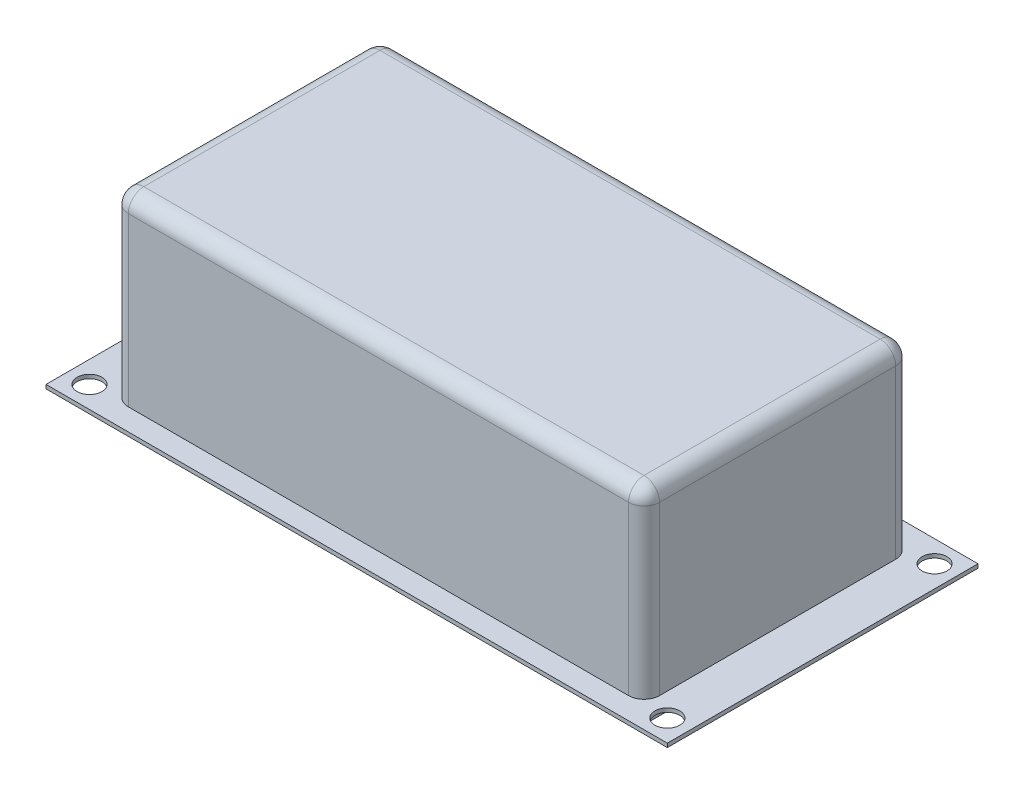
ISO-10303-21;
HEADER;
FILE_DESCRIPTION(('STEP AP214'),'2;1');
FILE_NAME('part.step','',(''),(''),'','','');
FILE_SCHEMA(('AUTOMOTIVE_DESIGN { 1 0 10303 214 1 1 1 1 }'));
ENDSEC;
DATA;
#1=APPLICATION_CONTEXT('core data for automotive mechanical design processes');
#2=APPLICATION_PROTOCOL_DEFINITION('international standard','automotive_design',2000,#1);
#3=PRODUCT_CONTEXT('',#1,'mechanical');
#4=PRODUCT('Part','Part','',(#3));
#5=PRODUCT_RELATED_PRODUCT_CATEGORY('part','',(#4));
#6=PRODUCT_DEFINITION_FORMATION('','',#4);
#7=PRODUCT_DEFINITION_CONTEXT('part definition',#1,'design');
#8=PRODUCT_DEFINITION('design','',#6,#7);
#9=PRODUCT_DEFINITION_SHAPE('','',#8);
#10=(LENGTH_UNIT() NAMED_UNIT(*) SI_UNIT(.MILLI.,.METRE.));
#11=(NAMED_UNIT(*) PLANE_ANGLE_UNIT() SI_UNIT($,.RADIAN.));
#12=(NAMED_UNIT(*) SI_UNIT($,.STERADIAN.) SOLID_ANGLE_UNIT());
#13=UNCERTAINTY_MEASURE_WITH_UNIT(LENGTH_MEASURE(1.E-05),#10,'distance_accuracy_value','');
#14=(GEOMETRIC_REPRESENTATION_CONTEXT(3) GLOBAL_UNCERTAINTY_ASSIGNED_CONTEXT((#13)) GLOBAL_UNIT_ASSIGNED_CONTEXT((#10,
#11,#12)) REPRESENTATION_CONTEXT('',''));
#15=CARTESIAN_POINT('',(0.,0.,0.));
#16=DIRECTION('',(0.,0.,1.));
#17=DIRECTION('',(1.,0.,0.));
#18=AXIS2_PLACEMENT_3D('',#15,#16,#17);
#19=CARTESIAN_POINT('',(0.,0.3175,0.));
#20=DIRECTION('',(0.,1.,0.));
#21=DIRECTION('',(0.,0.,1.));
#22=AXIS2_PLACEMENT_3D('',#19,#20,#21);
#23=PLANE('',#22);
#24=CARTESIAN_POINT('',(47.244,0.3175,21.844));
#25=DIRECTION('',(0.,-1.,0.));
#26=DIRECTION('',(0.,0.,1.));
#27=AXIS2_PLACEMENT_3D('',#24,#25,#26);
#28=CIRCLE('',#27,2.032);
#29=CARTESIAN_POINT('',(47.244,0.3175,23.876));
#30=VERTEX_POINT('',#29);
#31=EDGE_CURVE('E191',#30,#30,#28,.T.);
#32=ORIENTED_EDGE('',*,*,#31,.T.);
#33=EDGE_LOOP('',(#32));
#34=FACE_BOUND('',#33,.T.);
#35=CARTESIAN_POINT('',(47.244,0.3175,-21.844));
#36=DIRECTION('',(0.,1.,0.));
#37=DIRECTION('',(0.,0.,-1.));
#38=AXIS2_PLACEMENT_3D('',#35,#36,#37);
#39=CIRCLE('',#38,2.032);
#40=CARTESIAN_POINT('',(47.244,0.3175,-23.876));
#41=VERTEX_POINT('',#40);
#42=EDGE_CURVE('E199',#41,#41,#39,.T.);
#43=ORIENTED_EDGE('',*,*,#42,.F.);
#44=EDGE_LOOP('',(#43));
#45=FACE_BOUND('',#44,.T.);
#46=CARTESIAN_POINT('',(-47.244,0.3175,-21.844));
#47=DIRECTION('',(0.,-1.,0.));
#48=DIRECTION('',(0.,0.,-1.));
#49=AXIS2_PLACEMENT_3D('',#46,#47,#48);
#50=CIRCLE('',#49,2.032);
#51=CARTESIAN_POINT('',(-47.244,0.3175,-23.876));
#52=VERTEX_POINT('',#51);
#53=EDGE_CURVE('E205',#52,#52,#50,.T.);
#54=ORIENTED_EDGE('',*,*,#53,.T.);
#55=EDGE_LOOP('',(#54));
#56=FACE_BOUND('',#55,.T.);
#57=CARTESIAN_POINT('',(-47.244,0.3175,21.844));
#58=DIRECTION('',(0.,1.,0.));
#59=DIRECTION('',(0.,0.,1.));
#60=AXIS2_PLACEMENT_3D('',#57,#58,#59);
#61=CIRCLE('',#60,2.032);
#62=CARTESIAN_POINT('',(-47.244,0.3175,23.876));
#63=VERTEX_POINT('',#62);
#64=EDGE_CURVE('E211',#63,#63,#61,.T.);
#65=ORIENTED_EDGE('',*,*,#64,.F.);
#66=EDGE_LOOP('',(#65));
#67=FACE_BOUND('',#66,.T.);
#68=DIRECTION('',(0.,0.,-1.));
#69=VECTOR('',#68,1.);
#70=CARTESIAN_POINT('',(50.8,0.3175,-25.4));
#71=LINE('',#70,#69);
#72=CARTESIAN_POINT('',(50.8,0.3175,25.4));
#73=VERTEX_POINT('',#72);
#74=CARTESIAN_POINT('',(50.8,0.3175,-25.4));
#75=VERTEX_POINT('',#74);
#76=EDGE_CURVE('E220',#73,#75,#71,.T.);
#77=ORIENTED_EDGE('',*,*,#76,.T.);
#78=DIRECTION('',(-1.,0.,0.));
#79=VECTOR('',#78,1.);
#80=CARTESIAN_POINT('',(-50.8,0.3175,-25.4));
#81=LINE('',#80,#79);
#82=CARTESIAN_POINT('',(-50.8,0.3175,-25.4));
#83=VERTEX_POINT('',#82);
#84=EDGE_CURVE('E223',#75,#83,#81,.T.);
#85=ORIENTED_EDGE('',*,*,#84,.T.);
#86=DIRECTION('',(0.,0.,1.));
#87=VECTOR('',#86,1.);
#88=CARTESIAN_POINT('',(-50.8,0.3175,-25.4));
#89=LINE('',#88,#87);
#90=CARTESIAN_POINT('',(-50.8,0.3175,25.4));
#91=VERTEX_POINT('',#90);
#92=EDGE_CURVE('E226',#83,#91,#89,.T.);
#93=ORIENTED_EDGE('',*,*,#92,.T.);
#94=DIRECTION('',(1.,0.,0.));
#95=VECTOR('',#94,1.);
#96=CARTESIAN_POINT('',(-50.8,0.3175,25.4));
#97=LINE('',#96,#95);
#98=EDGE_CURVE('E228',#91,#73,#97,.T.);
#99=ORIENTED_EDGE('',*,*,#98,.T.);
#100=EDGE_LOOP('',(#77,#85,#93,#99));
#101=FACE_BOUND('',#100,.T.);
#102=DIRECTION('',(0.,0.,-1.));
#103=VECTOR('',#102,1.);
#104=CARTESIAN_POINT('',(-43.434,0.3175,0.));
#105=LINE('',#104,#103);
#106=CARTESIAN_POINT('',(-43.434,0.3175,19.304));
#107=VERTEX_POINT('',#106);
#108=CARTESIAN_POINT('',(-43.434,0.3175,-19.304));
#109=VERTEX_POINT('',#108);
#110=EDGE_CURVE('E261',#107,#109,#105,.T.);
#111=ORIENTED_EDGE('',*,*,#110,.T.);
#112=CARTESIAN_POINT('',(-40.894,0.317499999999998,-19.304));
#113=DIRECTION('',(0.,1.,0.));
#114=DIRECTION('',(0.,0.,1.));
#115=AXIS2_PLACEMENT_3D('',#112,#113,#114);
#116=CIRCLE('',#115,2.54);
#117=CARTESIAN_POINT('',(-40.894,0.3175,-21.844));
#118=VERTEX_POINT('',#117);
#119=EDGE_CURVE('E302',#109,#118,#116,.F.);
#120=ORIENTED_EDGE('',*,*,#119,.T.);
#121=DIRECTION('',(1.,0.,0.));
#122=VECTOR('',#121,1.);
#123=CARTESIAN_POINT('',(0.,0.3175,-21.844));
#124=LINE('',#123,#122);
#125=CARTESIAN_POINT('',(40.894,0.3175,-21.844));
#126=VERTEX_POINT('',#125);
#127=EDGE_CURVE('E264',#118,#126,#124,.T.);
#128=ORIENTED_EDGE('',*,*,#127,.T.);
#129=CARTESIAN_POINT('',(40.894,0.317499999999998,-19.304));
#130=DIRECTION('',(0.,1.,0.));
#131=DIRECTION('',(0.,0.,1.));
#132=AXIS2_PLACEMENT_3D('',#129,#130,#131);
#133=CIRCLE('',#132,2.54);
#134=CARTESIAN_POINT('',(43.434,0.3175,-19.304));
#135=VERTEX_POINT('',#134);
#136=EDGE_CURVE('E304',#126,#135,#133,.F.);
#137=ORIENTED_EDGE('',*,*,#136,.T.);
#138=DIRECTION('',(0.,0.,1.));
#139=VECTOR('',#138,1.);
#140=CARTESIAN_POINT('',(43.434,0.3175,0.));
#141=LINE('',#140,#139);
#142=CARTESIAN_POINT('',(43.434,0.3175,19.304));
#143=VERTEX_POINT('',#142);
#144=EDGE_CURVE('E267',#135,#143,#141,.T.);
#145=ORIENTED_EDGE('',*,*,#144,.T.);
#146=CARTESIAN_POINT('',(40.894,0.317499999999998,19.304));
#147=DIRECTION('',(0.,1.,0.));
#148=DIRECTION('',(0.,0.,1.));
#149=AXIS2_PLACEMENT_3D('',#146,#147,#148);
#150=CIRCLE('',#149,2.54);
#151=CARTESIAN_POINT('',(40.894,0.3175,21.844));
#152=VERTEX_POINT('',#151);
#153=EDGE_CURVE('E42',#143,#152,#150,.F.);
#154=ORIENTED_EDGE('',*,*,#153,.T.);
#155=DIRECTION('',(-1.,0.,0.));
#156=VECTOR('',#155,1.);
#157=CARTESIAN_POINT('',(0.,0.3175,21.844));
#158=LINE('',#157,#156);
#159=CARTESIAN_POINT('',(-40.894,0.3175,21.844));
#160=VERTEX_POINT('',#159);
#161=EDGE_CURVE('E258',#152,#160,#158,.T.);
#162=ORIENTED_EDGE('',*,*,#161,.T.);
#163=CARTESIAN_POINT('',(-40.894,0.317499999999998,19.304));
#164=DIRECTION('',(0.,1.,0.));
#165=DIRECTION('',(0.,0.,1.));
#166=AXIS2_PLACEMENT_3D('',#163,#164,#165);
#167=CIRCLE('',#166,2.54);
#168=EDGE_CURVE('E11',#160,#107,#167,.F.);
#169=ORIENTED_EDGE('',*,*,#168,.T.);
#170=EDGE_LOOP('',(#111,#120,#128,#137,#145,#154,#162,#169));
#171=FACE_BOUND('',#170,.T.);
#172=ADVANCED_FACE('F33',(#34,#45,#56,#67,#101,#171),#23,.T.);
#173=CARTESIAN_POINT('',(50.8,0.3175,-25.4));
#174=DIRECTION('',(-1.,0.,0.));
#175=DIRECTION('',(0.,0.,1.));
#176=AXIS2_PLACEMENT_3D('',#173,#174,#175);
#177=PLANE('',#176);
#178=DIRECTION('',(0.,0.,-1.));
#179=VECTOR('',#178,1.);
#180=CARTESIAN_POINT('',(50.8,-0.3175,-25.4));
#181=LINE('',#180,#179);
#182=CARTESIAN_POINT('',(50.8,-0.3175,25.4));
#183=VERTEX_POINT('',#182);
#184=CARTESIAN_POINT('',(50.8,-0.3175,-25.4));
#185=VERTEX_POINT('',#184);
#186=EDGE_CURVE('E217',#183,#185,#181,.T.);
#187=ORIENTED_EDGE('',*,*,#186,.T.);
#188=DIRECTION('',(0.,-1.,0.));
#189=VECTOR('',#188,1.);
#190=CARTESIAN_POINT('',(50.8,0.3175,-25.4));
#191=LINE('',#190,#189);
#192=EDGE_CURVE('E246',#75,#185,#191,.T.);
#193=ORIENTED_EDGE('',*,*,#192,.F.);
#194=ORIENTED_EDGE('',*,*,#76,.F.);
#195=DIRECTION('',(0.,-1.,0.));
#196=VECTOR('',#195,1.);
#197=CARTESIAN_POINT('',(50.8,0.3175,25.4));
#198=LINE('',#197,#196);
#199=EDGE_CURVE('E230',#73,#183,#198,.T.);
#200=ORIENTED_EDGE('',*,*,#199,.T.);
#201=EDGE_LOOP('',(#187,#193,#194,#200));
#202=FACE_BOUND('',#201,.T.);
#203=ADVANCED_FACE('F408',(#202),#177,.F.);
#204=CARTESIAN_POINT('',(-50.8,0.3175,-25.4));
#205=DIRECTION('',(0.,0.,1.));
#206=DIRECTION('',(1.,0.,0.));
#207=AXIS2_PLACEMENT_3D('',#204,#205,#206);
#208=PLANE('',#207);
#209=DIRECTION('',(-1.,0.,0.));
#210=VECTOR('',#209,1.);
#211=CARTESIAN_POINT('',(-50.8,-0.3175,-25.4));
#212=LINE('',#211,#210);
#213=CARTESIAN_POINT('',(-50.8,-0.3175,-25.4));
#214=VERTEX_POINT('',#213);
#215=EDGE_CURVE('E233',#185,#214,#212,.T.);
#216=ORIENTED_EDGE('',*,*,#215,.T.);
#217=DIRECTION('',(0.,-1.,0.));
#218=VECTOR('',#217,1.);
#219=CARTESIAN_POINT('',(-50.8,0.3175,-25.4));
#220=LINE('',#219,#218);
#221=EDGE_CURVE('E243',#83,#214,#220,.T.);
#222=ORIENTED_EDGE('',*,*,#221,.F.);
#223=ORIENTED_EDGE('',*,*,#84,.F.);
#224=ORIENTED_EDGE('',*,*,#192,.T.);
#225=EDGE_LOOP('',(#216,#222,#223,#224));
#226=FACE_BOUND('',#225,.T.);
#227=ADVANCED_FACE('F414',(#226),#208,.F.);
#228=CARTESIAN_POINT('',(-50.8,0.3175,-25.4));
#229=DIRECTION('',(1.,0.,0.));
#230=DIRECTION('',(0.,0.,-1.));
#231=AXIS2_PLACEMENT_3D('',#228,#229,#230);
#232=PLANE('',#231);
#233=DIRECTION('',(0.,0.,1.));
#234=VECTOR('',#233,1.);
#235=CARTESIAN_POINT('',(-50.8,-0.3175,-25.4));
#236=LINE('',#235,#234);
#237=CARTESIAN_POINT('',(-50.8,-0.3175,25.4));
#238=VERTEX_POINT('',#237);
#239=EDGE_CURVE('E235',#214,#238,#236,.T.);
#240=ORIENTED_EDGE('',*,*,#239,.T.);
#241=DIRECTION('',(0.,-1.,0.));
#242=VECTOR('',#241,1.);
#243=CARTESIAN_POINT('',(-50.8,0.3175,25.4));
#244=LINE('',#243,#242);
#245=EDGE_CURVE('E240',#91,#238,#244,.T.);
#246=ORIENTED_EDGE('',*,*,#245,.F.);
#247=ORIENTED_EDGE('',*,*,#92,.F.);
#248=ORIENTED_EDGE('',*,*,#221,.T.);
#249=EDGE_LOOP('',(#240,#246,#247,#248));
#250=FACE_BOUND('',#249,.T.);
#251=ADVANCED_FACE('F429',(#250),#232,.F.);
#252=CARTESIAN_POINT('',(-50.8,0.3175,25.4));
#253=DIRECTION('',(0.,0.,-1.));
#254=DIRECTION('',(-1.,0.,0.));
#255=AXIS2_PLACEMENT_3D('',#252,#253,#254);
#256=PLANE('',#255);
#257=DIRECTION('',(1.,0.,0.));
#258=VECTOR('',#257,1.);
#259=CARTESIAN_POINT('',(-50.8,-0.3175,25.4));
#260=LINE('',#259,#258);
#261=EDGE_CURVE('E224',#238,#183,#260,.T.);
#262=ORIENTED_EDGE('',*,*,#261,.T.);
#263=ORIENTED_EDGE('',*,*,#199,.F.);
#264=ORIENTED_EDGE('',*,*,#98,.F.);
#265=ORIENTED_EDGE('',*,*,#245,.T.);
#266=EDGE_LOOP('',(#262,#263,#264,#265));
#267=FACE_BOUND('',#266,.T.);
#268=ADVANCED_FACE('F425',(#267),#256,.F.);
#269=CARTESIAN_POINT('',(0.,-0.3175,0.));
#270=DIRECTION('',(0.,1.,0.));
#271=DIRECTION('',(0.,0.,1.));
#272=AXIS2_PLACEMENT_3D('',#269,#270,#271);
#273=PLANE('',#272);
#274=DIRECTION('',(1.,0.,0.));
#275=VECTOR('',#274,1.);
#276=CARTESIAN_POINT('',(0.,-0.3175,21.844));
#277=LINE('',#276,#275);
#278=CARTESIAN_POINT('',(-43.434,-0.3175,21.844));
#279=VERTEX_POINT('',#278);
#280=CARTESIAN_POINT('',(43.434,-0.3175,21.844));
#281=VERTEX_POINT('',#280);
#282=EDGE_CURVE('E253',#279,#281,#277,.T.);
#283=ORIENTED_EDGE('',*,*,#282,.T.);
#284=DIRECTION('',(0.,0.,-1.));
#285=VECTOR('',#284,1.);
#286=CARTESIAN_POINT('',(43.434,-0.3175,0.));
#287=LINE('',#286,#285);
#288=CARTESIAN_POINT('',(43.434,-0.3175,-21.844));
#289=VERTEX_POINT('',#288);
#290=EDGE_CURVE('E256',#281,#289,#287,.T.);
#291=ORIENTED_EDGE('',*,*,#290,.T.);
#292=DIRECTION('',(-1.,0.,0.));
#293=VECTOR('',#292,1.);
#294=CARTESIAN_POINT('',(0.,-0.3175,-21.844));
#295=LINE('',#294,#293);
#296=CARTESIAN_POINT('',(-43.434,-0.3175,-21.844));
#297=VERTEX_POINT('',#296);
#298=EDGE_CURVE('E164',#289,#297,#295,.T.);
#299=ORIENTED_EDGE('',*,*,#298,.T.);
#300=DIRECTION('',(0.,0.,1.));
#301=VECTOR('',#300,1.);
#302=CARTESIAN_POINT('',(-43.434,-0.3175,0.));
#303=LINE('',#302,#301);
#304=EDGE_CURVE('E250',#297,#279,#303,.T.);
#305=ORIENTED_EDGE('',*,*,#304,.T.);
#306=EDGE_LOOP('',(#283,#291,#299,#305));
#307=FACE_BOUND('',#306,.T.);
#308=CARTESIAN_POINT('',(47.244,-0.3175,21.844));
#309=DIRECTION('',(0.,-1.,0.));
#310=DIRECTION('',(0.,0.,1.));
#311=AXIS2_PLACEMENT_3D('',#308,#309,#310);
#312=CIRCLE('',#311,2.032);
#313=CARTESIAN_POINT('',(47.244,-0.3175,23.876));
#314=VERTEX_POINT('',#313);
#315=EDGE_CURVE('E196',#314,#314,#312,.T.);
#316=ORIENTED_EDGE('',*,*,#315,.F.);
#317=EDGE_LOOP('',(#316));
#318=FACE_BOUND('',#317,.T.);
#319=CARTESIAN_POINT('',(47.244,-0.3175,-21.844));
#320=DIRECTION('',(0.,1.,0.));
#321=DIRECTION('',(0.,0.,-1.));
#322=AXIS2_PLACEMENT_3D('',#319,#320,#321);
#323=CIRCLE('',#322,2.032);
#324=CARTESIAN_POINT('',(47.244,-0.3175,-23.876));
#325=VERTEX_POINT('',#324);
#326=EDGE_CURVE('E202',#325,#325,#323,.T.);
#327=ORIENTED_EDGE('',*,*,#326,.T.);
#328=EDGE_LOOP('',(#327));
#329=FACE_BOUND('',#328,.T.);
#330=CARTESIAN_POINT('',(-47.244,-0.3175,-21.844));
#331=DIRECTION('',(0.,-1.,0.));
#332=DIRECTION('',(0.,0.,-1.));
#333=AXIS2_PLACEMENT_3D('',#330,#331,#332);
#334=CIRCLE('',#333,2.032);
#335=CARTESIAN_POINT('',(-47.244,-0.3175,-23.876));
#336=VERTEX_POINT('',#335);
#337=EDGE_CURVE('E208',#336,#336,#334,.T.);
#338=ORIENTED_EDGE('',*,*,#337,.F.);
#339=EDGE_LOOP('',(#338));
#340=FACE_BOUND('',#339,.T.);
#341=CARTESIAN_POINT('',(-47.244,-0.3175,21.844));
#342=DIRECTION('',(0.,1.,0.));
#343=DIRECTION('',(0.,0.,1.));
#344=AXIS2_PLACEMENT_3D('',#341,#342,#343);
#345=CIRCLE('',#344,2.032);
#346=CARTESIAN_POINT('',(-47.244,-0.3175,23.876));
#347=VERTEX_POINT('',#346);
#348=EDGE_CURVE('E214',#347,#347,#345,.T.);
#349=ORIENTED_EDGE('',*,*,#348,.T.);
#350=EDGE_LOOP('',(#349));
#351=FACE_BOUND('',#350,.T.);
#352=ORIENTED_EDGE('',*,*,#186,.F.);
#353=ORIENTED_EDGE('',*,*,#261,.F.);
#354=ORIENTED_EDGE('',*,*,#239,.F.);
#355=ORIENTED_EDGE('',*,*,#215,.F.);
#356=EDGE_LOOP('',(#352,#353,#354,#355));
#357=FACE_BOUND('',#356,.T.);
#358=ADVANCED_FACE('F422',(#307,#318,#329,#340,#351,#357),#273,.F.);
#359=CARTESIAN_POINT('',(-47.244,-0.3175,21.844));
#360=DIRECTION('',(0.,1.,0.));
#361=DIRECTION('',(0.,0.,1.));
#362=AXIS2_PLACEMENT_3D('',#359,#360,#361);
#363=CYLINDRICAL_SURFACE('',#362,2.032);
#364=ORIENTED_EDGE('',*,*,#348,.F.);
#365=EDGE_LOOP('',(#364));
#366=FACE_BOUND('',#365,.T.);
#367=ORIENTED_EDGE('',*,*,#64,.T.);
#368=EDGE_LOOP('',(#367));
#369=FACE_BOUND('',#368,.T.);
#370=ADVANCED_FACE('F420',(#366,#369),#363,.F.);
#371=CARTESIAN_POINT('',(-47.244,-0.3175,-21.844));
#372=DIRECTION('',(0.,1.,0.));
#373=DIRECTION('',(0.,0.,1.));
#374=AXIS2_PLACEMENT_3D('',#371,#372,#373);
#375=CYLINDRICAL_SURFACE('',#374,2.032);
#376=ORIENTED_EDGE('',*,*,#337,.T.);
#377=EDGE_LOOP('',(#376));
#378=FACE_BOUND('',#377,.T.);
#379=ORIENTED_EDGE('',*,*,#53,.F.);
#380=EDGE_LOOP('',(#379));
#381=FACE_BOUND('',#380,.T.);
#382=ADVANCED_FACE('F633',(#378,#381),#375,.F.);
#383=CARTESIAN_POINT('',(47.244,-0.3175,-21.844));
#384=DIRECTION('',(0.,1.,0.));
#385=DIRECTION('',(0.,0.,1.));
#386=AXIS2_PLACEMENT_3D('',#383,#384,#385);
#387=CYLINDRICAL_SURFACE('',#386,2.032);
#388=ORIENTED_EDGE('',*,*,#326,.F.);
#389=EDGE_LOOP('',(#388));
#390=FACE_BOUND('',#389,.T.);
#391=ORIENTED_EDGE('',*,*,#42,.T.);
#392=EDGE_LOOP('',(#391));
#393=FACE_BOUND('',#392,.T.);
#394=ADVANCED_FACE('F623',(#390,#393),#387,.F.);
#395=CARTESIAN_POINT('',(47.244,-0.3175,21.844));
#396=DIRECTION('',(0.,1.,0.));
#397=DIRECTION('',(0.,0.,1.));
#398=AXIS2_PLACEMENT_3D('',#395,#396,#397);
#399=CYLINDRICAL_SURFACE('',#398,2.032);
#400=ORIENTED_EDGE('',*,*,#315,.T.);
#401=EDGE_LOOP('',(#400));
#402=FACE_BOUND('',#401,.T.);
#403=ORIENTED_EDGE('',*,*,#31,.F.);
#404=EDGE_LOOP('',(#403));
#405=FACE_BOUND('',#404,.T.);
#406=ADVANCED_FACE('F605',(#402,#405),#399,.F.);
#407=CARTESIAN_POINT('',(43.434,-2.54,-21.844));
#408=DIRECTION('',(1.,0.,0.));
#409=DIRECTION('',(0.,0.,-1.));
#410=AXIS2_PLACEMENT_3D('',#407,#408,#409);
#411=PLANE('',#410);
#412=ORIENTED_EDGE('',*,*,#290,.F.);
#413=DIRECTION('',(0.,1.,0.));
#414=VECTOR('',#413,1.);
#415=CARTESIAN_POINT('',(43.434,-2.54,21.844));
#416=LINE('',#415,#414);
#417=CARTESIAN_POINT('',(43.434,-2.54,21.844));
#418=VERTEX_POINT('',#417);
#419=EDGE_CURVE('E183',#418,#281,#416,.T.);
#420=ORIENTED_EDGE('',*,*,#419,.F.);
#421=DIRECTION('',(0.,0.,-1.));
#422=VECTOR('',#421,1.);
#423=CARTESIAN_POINT('',(43.434,-2.54,-21.844));
#424=LINE('',#423,#422);
#425=CARTESIAN_POINT('',(43.434,-2.54,-21.844));
#426=VERTEX_POINT('',#425);
#427=EDGE_CURVE('E176',#418,#426,#424,.T.);
#428=ORIENTED_EDGE('',*,*,#427,.T.);
#429=DIRECTION('',(0.,1.,0.));
#430=VECTOR('',#429,1.);
#431=CARTESIAN_POINT('',(43.434,-2.54,-21.844));
#432=LINE('',#431,#430);
#433=EDGE_CURVE('E159',#426,#289,#432,.T.);
#434=ORIENTED_EDGE('',*,*,#433,.T.);
#435=EDGE_LOOP('',(#412,#420,#428,#434));
#436=FACE_BOUND('',#435,.T.);
#437=ADVANCED_FACE('F181',(#436),#411,.T.);
#438=CARTESIAN_POINT('',(-43.434,-2.54,21.844));
#439=DIRECTION('',(0.,0.,1.));
#440=DIRECTION('',(1.,0.,0.));
#441=AXIS2_PLACEMENT_3D('',#438,#439,#440);
#442=PLANE('',#441);
#443=ORIENTED_EDGE('',*,*,#282,.F.);
#444=DIRECTION('',(0.,1.,0.));
#445=VECTOR('',#444,1.);
#446=CARTESIAN_POINT('',(-43.434,-2.54,21.844));
#447=LINE('',#446,#445);
#448=CARTESIAN_POINT('',(-43.434,-2.54,21.844));
#449=VERTEX_POINT('',#448);
#450=EDGE_CURVE('E192',#449,#279,#447,.T.);
#451=ORIENTED_EDGE('',*,*,#450,.F.);
#452=DIRECTION('',(1.,0.,0.));
#453=VECTOR('',#452,1.);
#454=CARTESIAN_POINT('',(-43.434,-2.54,21.844));
#455=LINE('',#454,#453);
#456=EDGE_CURVE('E169',#449,#418,#455,.T.);
#457=ORIENTED_EDGE('',*,*,#456,.T.);
#458=ORIENTED_EDGE('',*,*,#419,.T.);
#459=EDGE_LOOP('',(#443,#451,#457,#458));
#460=FACE_BOUND('',#459,.T.);
#461=ADVANCED_FACE('F586',(#460),#442,.T.);
#462=CARTESIAN_POINT('',(-43.434,-2.54,-21.844));
#463=DIRECTION('',(-1.,0.,0.));
#464=DIRECTION('',(0.,0.,1.));
#465=AXIS2_PLACEMENT_3D('',#462,#463,#464);
#466=PLANE('',#465);
#467=ORIENTED_EDGE('',*,*,#304,.F.);
#468=DIRECTION('',(0.,1.,0.));
#469=VECTOR('',#468,1.);
#470=CARTESIAN_POINT('',(-43.434,-2.54,-21.844));
#471=LINE('',#470,#469);
#472=CARTESIAN_POINT('',(-43.434,-2.54,-21.844));
#473=VERTEX_POINT('',#472);
#474=EDGE_CURVE('E168',#473,#297,#471,.T.);
#475=ORIENTED_EDGE('',*,*,#474,.F.);
#476=DIRECTION('',(0.,0.,1.));
#477=VECTOR('',#476,1.);
#478=CARTESIAN_POINT('',(-43.434,-2.54,-21.844));
#479=LINE('',#478,#477);
#480=EDGE_CURVE('E179',#473,#449,#479,.T.);
#481=ORIENTED_EDGE('',*,*,#480,.T.);
#482=ORIENTED_EDGE('',*,*,#450,.T.);
#483=EDGE_LOOP('',(#467,#475,#481,#482));
#484=FACE_BOUND('',#483,.T.);
#485=ADVANCED_FACE('F577',(#484),#466,.T.);
#486=CARTESIAN_POINT('',(-43.434,-2.54,-21.844));
#487=DIRECTION('',(0.,0.,-1.));
#488=DIRECTION('',(-1.,0.,0.));
#489=AXIS2_PLACEMENT_3D('',#486,#487,#488);
#490=PLANE('',#489);
#491=ORIENTED_EDGE('',*,*,#298,.F.);
#492=ORIENTED_EDGE('',*,*,#433,.F.);
#493=DIRECTION('',(-1.,0.,0.));
#494=VECTOR('',#493,1.);
#495=CARTESIAN_POINT('',(-43.434,-2.54,-21.844));
#496=LINE('',#495,#494);
#497=EDGE_CURVE('E162',#426,#473,#496,.T.);
#498=ORIENTED_EDGE('',*,*,#497,.T.);
#499=ORIENTED_EDGE('',*,*,#474,.T.);
#500=EDGE_LOOP('',(#491,#492,#498,#499));
#501=FACE_BOUND('',#500,.T.);
#502=ADVANCED_FACE('F161',(#501),#490,.T.);
#503=CARTESIAN_POINT('',(0.,-2.54,0.));
#504=DIRECTION('',(0.,1.,0.));
#505=DIRECTION('',(0.,0.,1.));
#506=AXIS2_PLACEMENT_3D('',#503,#504,#505);
#507=PLANE('',#506);
#508=ORIENTED_EDGE('',*,*,#427,.F.);
#509=ORIENTED_EDGE('',*,*,#456,.F.);
#510=ORIENTED_EDGE('',*,*,#480,.F.);
#511=ORIENTED_EDGE('',*,*,#497,.F.);
#512=EDGE_LOOP('',(#508,#509,#510,#511));
#513=FACE_BOUND('',#512,.T.);
#514=ADVANCED_FACE('F174',(#513),#507,.F.);
#515=CARTESIAN_POINT('',(43.434,30.226,-21.844));
#516=DIRECTION('',(-1.,0.,0.));
#517=DIRECTION('',(0.,0.,1.));
#518=AXIS2_PLACEMENT_3D('',#515,#516,#517);
#519=PLANE('',#518);
#520=ORIENTED_EDGE('',*,*,#144,.F.);
#521=DIRECTION('',(0.,-1.,0.));
#522=VECTOR('',#521,1.);
#523=CARTESIAN_POINT('',(43.434,30.226,-19.304));
#524=LINE('',#523,#522);
#525=CARTESIAN_POINT('',(43.434,27.686,-19.304));
#526=VERTEX_POINT('',#525);
#527=EDGE_CURVE('E296',#135,#526,#524,.F.);
#528=ORIENTED_EDGE('',*,*,#527,.T.);
#529=DIRECTION('',(0.,0.,-1.));
#530=VECTOR('',#529,1.);
#531=CARTESIAN_POINT('',(43.434,27.686,21.844));
#532=LINE('',#531,#530);
#533=CARTESIAN_POINT('',(43.434,27.686,19.304));
#534=VERTEX_POINT('',#533);
#535=EDGE_CURVE('E294',#526,#534,#532,.F.);
#536=ORIENTED_EDGE('',*,*,#535,.T.);
#537=DIRECTION('',(0.,-1.,0.));
#538=VECTOR('',#537,1.);
#539=CARTESIAN_POINT('',(43.434,30.226,19.304));
#540=LINE('',#539,#538);
#541=EDGE_CURVE('E292',#534,#143,#540,.T.);
#542=ORIENTED_EDGE('',*,*,#541,.T.);
#543=EDGE_LOOP('',(#520,#528,#536,#542));
#544=FACE_BOUND('',#543,.T.);
#545=ADVANCED_FACE('F351',(#544),#519,.F.);
#546=CARTESIAN_POINT('',(-43.434,30.226,-21.844));
#547=DIRECTION('',(0.,0.,1.));
#548=DIRECTION('',(1.,0.,0.));
#549=AXIS2_PLACEMENT_3D('',#546,#547,#548);
#550=PLANE('',#549);
#551=ORIENTED_EDGE('',*,*,#127,.F.);
#552=DIRECTION('',(0.,-1.,0.));
#553=VECTOR('',#552,1.);
#554=CARTESIAN_POINT('',(-40.894,30.226,-21.844));
#555=LINE('',#554,#553);
#556=CARTESIAN_POINT('',(-40.894,27.686,-21.844));
#557=VERTEX_POINT('',#556);
#558=EDGE_CURVE('E281',#118,#557,#555,.F.);
#559=ORIENTED_EDGE('',*,*,#558,.T.);
#560=DIRECTION('',(-1.,0.,0.));
#561=VECTOR('',#560,1.);
#562=CARTESIAN_POINT('',(43.434,27.686,-21.844));
#563=LINE('',#562,#561);
#564=CARTESIAN_POINT('',(40.894,27.686,-21.844));
#565=VERTEX_POINT('',#564);
#566=EDGE_CURVE('E279',#557,#565,#563,.F.);
#567=ORIENTED_EDGE('',*,*,#566,.T.);
#568=DIRECTION('',(0.,-1.,0.));
#569=VECTOR('',#568,1.);
#570=CARTESIAN_POINT('',(40.894,30.226,-21.844));
#571=LINE('',#570,#569);
#572=EDGE_CURVE('E277',#565,#126,#571,.T.);
#573=ORIENTED_EDGE('',*,*,#572,.T.);
#574=EDGE_LOOP('',(#551,#559,#567,#573));
#575=FACE_BOUND('',#574,.T.);
#576=ADVANCED_FACE('F394',(#575),#550,.F.);
#577=CARTESIAN_POINT('',(-43.434,30.226,-21.844));
#578=DIRECTION('',(1.,0.,0.));
#579=DIRECTION('',(0.,0.,-1.));
#580=AXIS2_PLACEMENT_3D('',#577,#578,#579);
#581=PLANE('',#580);
#582=DIRECTION('',(0.,0.,1.));
#583=VECTOR('',#582,1.);
#584=CARTESIAN_POINT('',(-43.434,27.686,-21.844));
#585=LINE('',#584,#583);
#586=CARTESIAN_POINT('',(-43.434,27.686,19.304));
#587=VERTEX_POINT('',#586);
#588=CARTESIAN_POINT('',(-43.434,27.686,-19.304));
#589=VERTEX_POINT('',#588);
#590=EDGE_CURVE('E270',#587,#589,#585,.F.);
#591=ORIENTED_EDGE('',*,*,#590,.T.);
#592=DIRECTION('',(0.,-1.,0.));
#593=VECTOR('',#592,1.);
#594=CARTESIAN_POINT('',(-43.434,30.226,-19.304));
#595=LINE('',#594,#593);
#596=EDGE_CURVE('E274',#589,#109,#595,.T.);
#597=ORIENTED_EDGE('',*,*,#596,.T.);
#598=ORIENTED_EDGE('',*,*,#110,.F.);
#599=DIRECTION('',(0.,-1.,0.));
#600=VECTOR('',#599,1.);
#601=CARTESIAN_POINT('',(-43.434,30.226,19.304));
#602=LINE('',#601,#600);
#603=EDGE_CURVE('E272',#107,#587,#602,.F.);
#604=ORIENTED_EDGE('',*,*,#603,.T.);
#605=EDGE_LOOP('',(#591,#597,#598,#604));
#606=FACE_BOUND('',#605,.T.);
#607=ADVANCED_FACE('F386',(#606),#581,.F.);
#608=CARTESIAN_POINT('',(-43.434,30.226,21.844));
#609=DIRECTION('',(0.,0.,-1.));
#610=DIRECTION('',(-1.,0.,0.));
#611=AXIS2_PLACEMENT_3D('',#608,#609,#610);
#612=PLANE('',#611);
#613=ORIENTED_EDGE('',*,*,#161,.F.);
#614=DIRECTION('',(0.,-1.,0.));
#615=VECTOR('',#614,1.);
#616=CARTESIAN_POINT('',(40.894,30.226,21.844));
#617=LINE('',#616,#615);
#618=CARTESIAN_POINT('',(40.894,27.686,21.844));
#619=VERTEX_POINT('',#618);
#620=EDGE_CURVE('E50',#152,#619,#617,.F.);
#621=ORIENTED_EDGE('',*,*,#620,.T.);
#622=DIRECTION('',(1.,0.,0.));
#623=VECTOR('',#622,1.);
#624=CARTESIAN_POINT('',(-43.434,27.686,21.844));
#625=LINE('',#624,#623);
#626=CARTESIAN_POINT('',(-40.894,27.686,21.844));
#627=VERTEX_POINT('',#626);
#628=EDGE_CURVE('E55',#619,#627,#625,.F.);
#629=ORIENTED_EDGE('',*,*,#628,.T.);
#630=DIRECTION('',(0.,-1.,0.));
#631=VECTOR('',#630,1.);
#632=CARTESIAN_POINT('',(-40.894,30.226,21.844));
#633=LINE('',#632,#631);
#634=EDGE_CURVE('E298',#627,#160,#633,.T.);
#635=ORIENTED_EDGE('',*,*,#634,.T.);
#636=EDGE_LOOP('',(#613,#621,#629,#635));
#637=FACE_BOUND('',#636,.T.);
#638=ADVANCED_FACE('F383',(#637),#612,.F.);
#639=CARTESIAN_POINT('',(0.,30.226,0.));
#640=DIRECTION('',(0.,1.,0.));
#641=DIRECTION('',(0.,0.,1.));
#642=AXIS2_PLACEMENT_3D('',#639,#640,#641);
#643=PLANE('',#642);
#644=DIRECTION('',(0.,0.,-1.));
#645=VECTOR('',#644,1.);
#646=CARTESIAN_POINT('',(40.894,30.226,-21.844));
#647=LINE('',#646,#645);
#648=CARTESIAN_POINT('',(40.894,30.226,19.304));
#649=VERTEX_POINT('',#648);
#650=CARTESIAN_POINT('',(40.894,30.226,-19.304));
#651=VERTEX_POINT('',#650);
#652=EDGE_CURVE('E287',#649,#651,#647,.T.);
#653=ORIENTED_EDGE('',*,*,#652,.T.);
#654=DIRECTION('',(-1.,0.,0.));
#655=VECTOR('',#654,1.);
#656=CARTESIAN_POINT('',(-43.434,30.226,-19.304));
#657=LINE('',#656,#655);
#658=CARTESIAN_POINT('',(-40.894,30.226,-19.304));
#659=VERTEX_POINT('',#658);
#660=EDGE_CURVE('E289',#651,#659,#657,.T.);
#661=ORIENTED_EDGE('',*,*,#660,.T.);
#662=DIRECTION('',(0.,0.,1.));
#663=VECTOR('',#662,1.);
#664=CARTESIAN_POINT('',(-40.894,30.226,21.844));
#665=LINE('',#664,#663);
#666=CARTESIAN_POINT('',(-40.894,30.226,19.304));
#667=VERTEX_POINT('',#666);
#668=EDGE_CURVE('E283',#659,#667,#665,.T.);
#669=ORIENTED_EDGE('',*,*,#668,.T.);
#670=DIRECTION('',(1.,0.,0.));
#671=VECTOR('',#670,1.);
#672=CARTESIAN_POINT('',(43.434,30.226,19.304));
#673=LINE('',#672,#671);
#674=EDGE_CURVE('E285',#667,#649,#673,.T.);
#675=ORIENTED_EDGE('',*,*,#674,.T.);
#676=EDGE_LOOP('',(#653,#661,#669,#675));
#677=FACE_BOUND('',#676,.T.);
#678=ADVANCED_FACE('F369',(#677),#643,.T.);
#679=CARTESIAN_POINT('',(40.894,30.226,19.304));
#680=DIRECTION('',(0.,-1.,0.));
#681=DIRECTION('',(0.,0.,-1.));
#682=AXIS2_PLACEMENT_3D('',#679,#680,#681);
#683=CYLINDRICAL_SURFACE('',#682,2.54);
#684=CARTESIAN_POINT('',(40.894,27.686,19.304));
#685=DIRECTION('',(0.,1.,0.));
#686=DIRECTION('',(0.,0.,1.));
#687=AXIS2_PLACEMENT_3D('',#684,#685,#686);
#688=CIRCLE('',#687,2.54);
#689=EDGE_CURVE('E37',#619,#534,#688,.T.);
#690=ORIENTED_EDGE('',*,*,#689,.F.);
#691=ORIENTED_EDGE('',*,*,#620,.F.);
#692=ORIENTED_EDGE('',*,*,#153,.F.);
#693=ORIENTED_EDGE('',*,*,#541,.F.);
#694=EDGE_LOOP('',(#690,#691,#692,#693));
#695=FACE_BOUND('',#694,.T.);
#696=ADVANCED_FACE('F35',(#695),#683,.T.);
#697=CARTESIAN_POINT('',(40.894,27.686,19.304));
#698=DIRECTION('',(0.,0.,1.));
#699=DIRECTION('',(1.,0.,0.));
#700=AXIS2_PLACEMENT_3D('',#697,#698,#699);
#701=SPHERICAL_SURFACE('',#700,2.54);
#702=CARTESIAN_POINT('',(40.894,27.686,19.304));
#703=DIRECTION('',(1.,0.,0.));
#704=DIRECTION('',(0.,0.,-1.));
#705=AXIS2_PLACEMENT_3D('',#702,#703,#704);
#706=CIRCLE('',#705,2.54);
#707=EDGE_CURVE('E333',#619,#649,#706,.F.);
#708=ORIENTED_EDGE('',*,*,#707,.F.);
#709=ORIENTED_EDGE('',*,*,#689,.T.);
#710=CARTESIAN_POINT('',(40.894,27.686,19.304));
#711=DIRECTION('',(0.,0.,1.));
#712=DIRECTION('',(1.,0.,0.));
#713=AXIS2_PLACEMENT_3D('',#710,#711,#712);
#714=CIRCLE('',#713,2.54);
#715=EDGE_CURVE('E186',#649,#534,#714,.F.);
#716=ORIENTED_EDGE('',*,*,#715,.F.);
#717=EDGE_LOOP('',(#708,#709,#716));
#718=FACE_BOUND('',#717,.T.);
#719=ADVANCED_FACE('F345',(#718),#701,.T.);
#720=CARTESIAN_POINT('',(40.894,30.226,-19.304));
#721=DIRECTION('',(0.,-1.,0.));
#722=DIRECTION('',(0.,0.,-1.));
#723=AXIS2_PLACEMENT_3D('',#720,#721,#722);
#724=CYLINDRICAL_SURFACE('',#723,2.54);
#725=ORIENTED_EDGE('',*,*,#136,.F.);
#726=ORIENTED_EDGE('',*,*,#572,.F.);
#727=CARTESIAN_POINT('',(40.894,27.686,-19.304));
#728=DIRECTION('',(0.,1.,0.));
#729=DIRECTION('',(0.,0.,1.));
#730=AXIS2_PLACEMENT_3D('',#727,#728,#729);
#731=CIRCLE('',#730,2.54);
#732=EDGE_CURVE('E330',#526,#565,#731,.T.);
#733=ORIENTED_EDGE('',*,*,#732,.F.);
#734=ORIENTED_EDGE('',*,*,#527,.F.);
#735=EDGE_LOOP('',(#725,#726,#733,#734));
#736=FACE_BOUND('',#735,.T.);
#737=ADVANCED_FACE('F358',(#736),#724,.T.);
#738=CARTESIAN_POINT('',(40.894,27.686,0.));
#739=DIRECTION('',(0.,0.,1.));
#740=DIRECTION('',(1.,0.,0.));
#741=AXIS2_PLACEMENT_3D('',#738,#739,#740);
#742=CYLINDRICAL_SURFACE('',#741,2.54);
#743=ORIENTED_EDGE('',*,*,#715,.T.);
#744=ORIENTED_EDGE('',*,*,#535,.F.);
#745=CARTESIAN_POINT('',(40.894,27.686,-19.304));
#746=DIRECTION('',(0.,0.,-1.));
#747=DIRECTION('',(-1.,0.,0.));
#748=AXIS2_PLACEMENT_3D('',#745,#746,#747);
#749=CIRCLE('',#748,2.54);
#750=EDGE_CURVE('E327',#651,#526,#749,.T.);
#751=ORIENTED_EDGE('',*,*,#750,.F.);
#752=ORIENTED_EDGE('',*,*,#652,.F.);
#753=EDGE_LOOP('',(#743,#744,#751,#752));
#754=FACE_BOUND('',#753,.T.);
#755=ADVANCED_FACE('F340',(#754),#742,.T.);
#756=CARTESIAN_POINT('',(0.,27.686,19.304));
#757=DIRECTION('',(-1.,0.,0.));
#758=DIRECTION('',(0.,0.,1.));
#759=AXIS2_PLACEMENT_3D('',#756,#757,#758);
#760=CYLINDRICAL_SURFACE('',#759,2.54);
#761=ORIENTED_EDGE('',*,*,#707,.T.);
#762=ORIENTED_EDGE('',*,*,#674,.F.);
#763=CARTESIAN_POINT('',(-40.894,27.686,19.304));
#764=DIRECTION('',(-1.,0.,0.));
#765=DIRECTION('',(0.,0.,1.));
#766=AXIS2_PLACEMENT_3D('',#763,#764,#765);
#767=CIRCLE('',#766,2.54);
#768=EDGE_CURVE('E324',#627,#667,#767,.T.);
#769=ORIENTED_EDGE('',*,*,#768,.F.);
#770=ORIENTED_EDGE('',*,*,#628,.F.);
#771=EDGE_LOOP('',(#761,#762,#769,#770));
#772=FACE_BOUND('',#771,.T.);
#773=ADVANCED_FACE('F373',(#772),#760,.T.);
#774=CARTESIAN_POINT('',(-40.894,30.226,19.304));
#775=DIRECTION('',(0.,-1.,0.));
#776=DIRECTION('',(0.,0.,-1.));
#777=AXIS2_PLACEMENT_3D('',#774,#775,#776);
#778=CYLINDRICAL_SURFACE('',#777,2.54);
#779=ORIENTED_EDGE('',*,*,#168,.F.);
#780=ORIENTED_EDGE('',*,*,#634,.F.);
#781=CARTESIAN_POINT('',(-40.894,27.686,19.304));
#782=DIRECTION('',(0.,1.,0.));
#783=DIRECTION('',(0.,0.,1.));
#784=AXIS2_PLACEMENT_3D('',#781,#782,#783);
#785=CIRCLE('',#784,2.54);
#786=EDGE_CURVE('E321',#587,#627,#785,.T.);
#787=ORIENTED_EDGE('',*,*,#786,.F.);
#788=ORIENTED_EDGE('',*,*,#603,.F.);
#789=EDGE_LOOP('',(#779,#780,#787,#788));
#790=FACE_BOUND('',#789,.T.);
#791=ADVANCED_FACE('F382',(#790),#778,.T.);
#792=CARTESIAN_POINT('',(40.894,27.686,-19.304));
#793=DIRECTION('',(0.,0.,1.));
#794=DIRECTION('',(1.,0.,0.));
#795=AXIS2_PLACEMENT_3D('',#792,#793,#794);
#796=SPHERICAL_SURFACE('',#795,2.54);
#797=ORIENTED_EDGE('',*,*,#750,.T.);
#798=ORIENTED_EDGE('',*,*,#732,.T.);
#799=CARTESIAN_POINT('',(40.894,27.686,-19.304));
#800=DIRECTION('',(1.,0.,0.));
#801=DIRECTION('',(0.,1.,0.));
#802=AXIS2_PLACEMENT_3D('',#799,#800,#801);
#803=CIRCLE('',#802,2.54);
#804=EDGE_CURVE('E318',#651,#565,#803,.F.);
#805=ORIENTED_EDGE('',*,*,#804,.F.);
#806=EDGE_LOOP('',(#797,#798,#805));
#807=FACE_BOUND('',#806,.T.);
#808=ADVANCED_FACE('F361',(#807),#796,.T.);
#809=CARTESIAN_POINT('',(-40.894,27.686,19.304));
#810=DIRECTION('',(0.,0.,1.));
#811=DIRECTION('',(1.,0.,0.));
#812=AXIS2_PLACEMENT_3D('',#809,#810,#811);
#813=SPHERICAL_SURFACE('',#812,2.54);
#814=ORIENTED_EDGE('',*,*,#786,.T.);
#815=ORIENTED_EDGE('',*,*,#768,.T.);
#816=CARTESIAN_POINT('',(-40.894,27.686,19.304));
#817=DIRECTION('',(0.,0.,1.));
#818=DIRECTION('',(1.,0.,0.));
#819=AXIS2_PLACEMENT_3D('',#816,#817,#818);
#820=CIRCLE('',#819,2.54);
#821=EDGE_CURVE('E315',#587,#667,#820,.F.);
#822=ORIENTED_EDGE('',*,*,#821,.F.);
#823=EDGE_LOOP('',(#814,#815,#822));
#824=FACE_BOUND('',#823,.T.);
#825=ADVANCED_FACE('F377',(#824),#813,.T.);
#826=CARTESIAN_POINT('',(0.,27.686,-19.304));
#827=DIRECTION('',(1.,0.,0.));
#828=DIRECTION('',(0.,0.,-1.));
#829=AXIS2_PLACEMENT_3D('',#826,#827,#828);
#830=CYLINDRICAL_SURFACE('',#829,2.54);
#831=ORIENTED_EDGE('',*,*,#804,.T.);
#832=ORIENTED_EDGE('',*,*,#566,.F.);
#833=CARTESIAN_POINT('',(-40.894,27.686,-19.304));
#834=DIRECTION('',(-1.,0.,0.));
#835=DIRECTION('',(0.,0.,1.));
#836=AXIS2_PLACEMENT_3D('',#833,#834,#835);
#837=CIRCLE('',#836,2.54);
#838=EDGE_CURVE('E312',#659,#557,#837,.T.);
#839=ORIENTED_EDGE('',*,*,#838,.F.);
#840=ORIENTED_EDGE('',*,*,#660,.F.);
#841=EDGE_LOOP('',(#831,#832,#839,#840));
#842=FACE_BOUND('',#841,.T.);
#843=ADVANCED_FACE('F366',(#842),#830,.T.);
#844=CARTESIAN_POINT('',(-40.894,27.686,0.));
#845=DIRECTION('',(0.,0.,-1.));
#846=DIRECTION('',(-1.,0.,0.));
#847=AXIS2_PLACEMENT_3D('',#844,#845,#846);
#848=CYLINDRICAL_SURFACE('',#847,2.54);
#849=ORIENTED_EDGE('',*,*,#821,.T.);
#850=ORIENTED_EDGE('',*,*,#668,.F.);
#851=CARTESIAN_POINT('',(-40.894,27.686,-19.304));
#852=DIRECTION('',(0.,0.,-1.));
#853=DIRECTION('',(-1.,0.,0.));
#854=AXIS2_PLACEMENT_3D('',#851,#852,#853);
#855=CIRCLE('',#854,2.54);
#856=EDGE_CURVE('E310',#589,#659,#855,.T.);
#857=ORIENTED_EDGE('',*,*,#856,.F.);
#858=ORIENTED_EDGE('',*,*,#590,.F.);
#859=EDGE_LOOP('',(#849,#850,#857,#858));
#860=FACE_BOUND('',#859,.T.);
#861=ADVANCED_FACE('F398',(#860),#848,.T.);
#862=CARTESIAN_POINT('',(-40.894,27.686,-19.304));
#863=DIRECTION('',(0.,0.,1.));
#864=DIRECTION('',(1.,0.,0.));
#865=AXIS2_PLACEMENT_3D('',#862,#863,#864);
#866=SPHERICAL_SURFACE('',#865,2.54);
#867=ORIENTED_EDGE('',*,*,#856,.T.);
#868=ORIENTED_EDGE('',*,*,#838,.T.);
#869=CARTESIAN_POINT('',(-40.894,27.686,-19.304));
#870=DIRECTION('',(0.,1.,0.));
#871=DIRECTION('',(0.,0.,1.));
#872=AXIS2_PLACEMENT_3D('',#869,#870,#871);
#873=CIRCLE('',#872,2.54);
#874=EDGE_CURVE('E307',#589,#557,#873,.F.);
#875=ORIENTED_EDGE('',*,*,#874,.F.);
#876=EDGE_LOOP('',(#867,#868,#875));
#877=FACE_BOUND('',#876,.T.);
#878=ADVANCED_FACE('F396',(#877),#866,.T.);
#879=CARTESIAN_POINT('',(-40.894,30.226,-19.304));
#880=DIRECTION('',(0.,-1.,0.));
#881=DIRECTION('',(0.,0.,-1.));
#882=AXIS2_PLACEMENT_3D('',#879,#880,#881);
#883=CYLINDRICAL_SURFACE('',#882,2.54);
#884=ORIENTED_EDGE('',*,*,#874,.T.);
#885=ORIENTED_EDGE('',*,*,#558,.F.);
#886=ORIENTED_EDGE('',*,*,#119,.F.);
#887=ORIENTED_EDGE('',*,*,#596,.F.);
#888=EDGE_LOOP('',(#884,#885,#886,#887));
#889=FACE_BOUND('',#888,.T.);
#890=ADVANCED_FACE('F390',(#889),#883,.T.);
#891=CLOSED_SHELL('',(#172,#203,#227,#251,#268,#358,#370,#382,#394,#406,#437,#461,#485,#502,
#514,#545,#576,#607,#638,#678,#696,#719,#737,#755,#773,#791,#808,#825,#843,#861,#878,#890));
#892=MANIFOLD_SOLID_BREP('B2',#891);
#893=ADVANCED_BREP_SHAPE_REPRESENTATION('',(#18,#892),#14);
#894=SHAPE_DEFINITION_REPRESENTATION(#9,#893);
ENDSEC;
END-ISO-10303-21;
